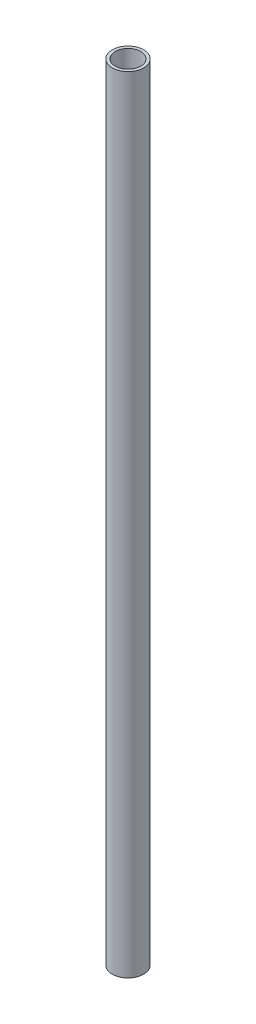
ISO-10303-21;
HEADER;
FILE_DESCRIPTION(('STEP AP214'),'2;1');
FILE_NAME('part.step','',(''),(''),'','','');
FILE_SCHEMA(('AUTOMOTIVE_DESIGN { 1 0 10303 214 1 1 1 1 }'));
ENDSEC;
DATA;
#1=APPLICATION_CONTEXT('core data for automotive mechanical design processes');
#2=APPLICATION_PROTOCOL_DEFINITION('international standard','automotive_design',2000,#1);
#3=PRODUCT_CONTEXT('',#1,'mechanical');
#4=PRODUCT('Part','Part','',(#3));
#5=PRODUCT_RELATED_PRODUCT_CATEGORY('part','',(#4));
#6=PRODUCT_DEFINITION_FORMATION('','',#4);
#7=PRODUCT_DEFINITION_CONTEXT('part definition',#1,'design');
#8=PRODUCT_DEFINITION('design','',#6,#7);
#9=PRODUCT_DEFINITION_SHAPE('','',#8);
#10=(LENGTH_UNIT() NAMED_UNIT(*) SI_UNIT(.MILLI.,.METRE.));
#11=(NAMED_UNIT(*) PLANE_ANGLE_UNIT() SI_UNIT($,.RADIAN.));
#12=(NAMED_UNIT(*) SI_UNIT($,.STERADIAN.) SOLID_ANGLE_UNIT());
#13=UNCERTAINTY_MEASURE_WITH_UNIT(LENGTH_MEASURE(1.E-05),#10,'distance_accuracy_value','');
#14=(GEOMETRIC_REPRESENTATION_CONTEXT(3) GLOBAL_UNCERTAINTY_ASSIGNED_CONTEXT((#13)) GLOBAL_UNIT_ASSIGNED_CONTEXT((#10,
#11,#12)) REPRESENTATION_CONTEXT('',''));
#15=CARTESIAN_POINT('',(0.,0.,0.));
#16=DIRECTION('',(0.,0.,1.));
#17=DIRECTION('',(1.,0.,0.));
#18=AXIS2_PLACEMENT_3D('',#15,#16,#17);
#19=CARTESIAN_POINT('',(0.,400.,0.));
#20=DIRECTION('',(0.,1.,0.));
#21=DIRECTION('',(0.,0.,1.));
#22=AXIS2_PLACEMENT_3D('',#19,#20,#21);
#23=PLANE('',#22);
#24=CARTESIAN_POINT('',(0.,400.,0.));
#25=DIRECTION('',(0.,1.,0.));
#26=DIRECTION('',(0.,0.,1.));
#27=AXIS2_PLACEMENT_3D('',#24,#25,#26);
#28=CIRCLE('',#27,8.);
#29=CARTESIAN_POINT('',(0.,400.,8.));
#30=VERTEX_POINT('',#29);
#31=EDGE_CURVE('E10',#30,#30,#28,.T.);
#32=ORIENTED_EDGE('',*,*,#31,.T.);
#33=EDGE_LOOP('',(#32));
#34=FACE_BOUND('',#33,.T.);
#35=CARTESIAN_POINT('',(0.,400.,0.));
#36=DIRECTION('',(0.,1.,0.));
#37=DIRECTION('',(0.,0.,1.));
#38=AXIS2_PLACEMENT_3D('',#35,#36,#37);
#39=CIRCLE('',#38,6.5);
#40=CARTESIAN_POINT('',(0.,400.,6.5));
#41=VERTEX_POINT('',#40);
#42=EDGE_CURVE('E46',#41,#41,#39,.T.);
#43=ORIENTED_EDGE('',*,*,#42,.F.);
#44=EDGE_LOOP('',(#43));
#45=FACE_BOUND('',#44,.T.);
#46=ADVANCED_FACE('F35',(#34,#45),#23,.T.);
#47=CARTESIAN_POINT('',(0.,0.,0.));
#48=DIRECTION('',(0.,1.,0.));
#49=DIRECTION('',(0.,0.,1.));
#50=AXIS2_PLACEMENT_3D('',#47,#48,#49);
#51=PLANE('',#50);
#52=CARTESIAN_POINT('',(0.,0.,0.));
#53=DIRECTION('',(0.,1.,0.));
#54=DIRECTION('',(0.,0.,1.));
#55=AXIS2_PLACEMENT_3D('',#52,#53,#54);
#56=CIRCLE('',#55,8.);
#57=CARTESIAN_POINT('',(0.,0.,8.));
#58=VERTEX_POINT('',#57);
#59=EDGE_CURVE('E39',#58,#58,#56,.T.);
#60=ORIENTED_EDGE('',*,*,#59,.F.);
#61=EDGE_LOOP('',(#60));
#62=FACE_BOUND('',#61,.T.);
#63=CARTESIAN_POINT('',(0.,0.,0.));
#64=DIRECTION('',(0.,1.,0.));
#65=DIRECTION('',(0.,0.,1.));
#66=AXIS2_PLACEMENT_3D('',#63,#64,#65);
#67=CIRCLE('',#66,6.5);
#68=CARTESIAN_POINT('',(0.,0.,6.5));
#69=VERTEX_POINT('',#68);
#70=EDGE_CURVE('E48',#69,#69,#67,.T.);
#71=ORIENTED_EDGE('',*,*,#70,.T.);
#72=EDGE_LOOP('',(#71));
#73=FACE_BOUND('',#72,.T.);
#74=ADVANCED_FACE('F58',(#62,#73),#51,.F.);
#75=CARTESIAN_POINT('',(0.,400.,0.));
#76=DIRECTION('',(0.,-1.,0.));
#77=DIRECTION('',(0.,0.,-1.));
#78=AXIS2_PLACEMENT_3D('',#75,#76,#77);
#79=CYLINDRICAL_SURFACE('',#78,8.);
#80=ORIENTED_EDGE('',*,*,#31,.F.);
#81=EDGE_LOOP('',(#80));
#82=FACE_BOUND('',#81,.T.);
#83=ORIENTED_EDGE('',*,*,#59,.T.);
#84=EDGE_LOOP('',(#83));
#85=FACE_BOUND('',#84,.T.);
#86=ADVANCED_FACE('F37',(#82,#85),#79,.T.);
#87=CARTESIAN_POINT('',(0.,400.,0.));
#88=DIRECTION('',(0.,-1.,0.));
#89=DIRECTION('',(0.,0.,-1.));
#90=AXIS2_PLACEMENT_3D('',#87,#88,#89);
#91=CYLINDRICAL_SURFACE('',#90,6.5);
#92=ORIENTED_EDGE('',*,*,#42,.T.);
#93=EDGE_LOOP('',(#92));
#94=FACE_BOUND('',#93,.T.);
#95=ORIENTED_EDGE('',*,*,#70,.F.);
#96=EDGE_LOOP('',(#95));
#97=FACE_BOUND('',#96,.T.);
#98=ADVANCED_FACE('F54',(#94,#97),#91,.F.);
#99=CLOSED_SHELL('',(#46,#74,#86,#98));
#100=MANIFOLD_SOLID_BREP('B2',#99);
#101=ADVANCED_BREP_SHAPE_REPRESENTATION('',(#18,#100),#14);
#102=SHAPE_DEFINITION_REPRESENTATION(#9,#101);
ENDSEC;
END-ISO-10303-21;
